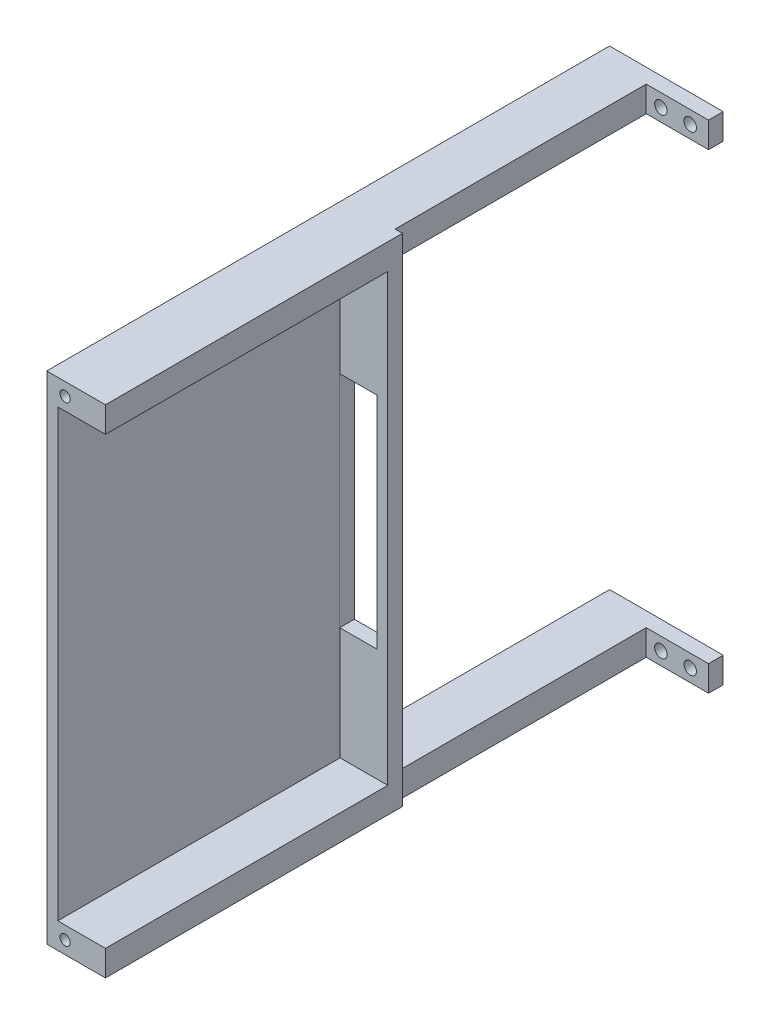
ISO-10303-21;
HEADER;
FILE_DESCRIPTION(('STEP AP214'),'2;1');
FILE_NAME('part.step','',(''),(''),'','','');
FILE_SCHEMA(('AUTOMOTIVE_DESIGN { 1 0 10303 214 1 1 1 1 }'));
ENDSEC;
DATA;
#1=APPLICATION_CONTEXT('core data for automotive mechanical design processes');
#2=APPLICATION_PROTOCOL_DEFINITION('international standard','automotive_design',2000,#1);
#3=PRODUCT_CONTEXT('',#1,'mechanical');
#4=PRODUCT('Part','Part','',(#3));
#5=PRODUCT_RELATED_PRODUCT_CATEGORY('part','',(#4));
#6=PRODUCT_DEFINITION_FORMATION('','',#4);
#7=PRODUCT_DEFINITION_CONTEXT('part definition',#1,'design');
#8=PRODUCT_DEFINITION('design','',#6,#7);
#9=PRODUCT_DEFINITION_SHAPE('','',#8);
#10=(LENGTH_UNIT() NAMED_UNIT(*) SI_UNIT(.MILLI.,.METRE.));
#11=(NAMED_UNIT(*) PLANE_ANGLE_UNIT() SI_UNIT($,.RADIAN.));
#12=(NAMED_UNIT(*) SI_UNIT($,.STERADIAN.) SOLID_ANGLE_UNIT());
#13=UNCERTAINTY_MEASURE_WITH_UNIT(LENGTH_MEASURE(1.E-05),#10,'distance_accuracy_value','');
#14=(GEOMETRIC_REPRESENTATION_CONTEXT(3) GLOBAL_UNCERTAINTY_ASSIGNED_CONTEXT((#13)) GLOBAL_UNIT_ASSIGNED_CONTEXT((#10,
#11,#12)) REPRESENTATION_CONTEXT('',''));
#15=CARTESIAN_POINT('',(0.,0.,0.));
#16=DIRECTION('',(0.,0.,1.));
#17=DIRECTION('',(1.,0.,0.));
#18=AXIS2_PLACEMENT_3D('',#15,#16,#17);
#19=CARTESIAN_POINT('',(-158.,64.2,390.9));
#20=DIRECTION('',(0.,0.,1.));
#21=DIRECTION('',(1.,0.,0.));
#22=AXIS2_PLACEMENT_3D('',#19,#20,#21);
#23=PLANE('',#22);
#24=CARTESIAN_POINT('',(-158.,64.2,390.9));
#25=DIRECTION('',(0.,0.,1.));
#26=DIRECTION('',(1.,0.,0.));
#27=AXIS2_PLACEMENT_3D('',#24,#25,#26);
#28=CIRCLE('',#27,1.4);
#29=CARTESIAN_POINT('',(-156.6,64.2,390.9));
#30=VERTEX_POINT('',#29);
#31=EDGE_CURVE('E512',#30,#30,#28,.T.);
#32=ORIENTED_EDGE('',*,*,#31,.T.);
#33=EDGE_LOOP('',(#32));
#34=FACE_BOUND('',#33,.T.);
#35=ADVANCED_FACE('F14',(#34),#23,.T.);
#36=CARTESIAN_POINT('',(-158.,-64.2,390.9));
#37=DIRECTION('',(0.,0.,1.));
#38=DIRECTION('',(1.,0.,0.));
#39=AXIS2_PLACEMENT_3D('',#36,#37,#38);
#40=PLANE('',#39);
#41=CARTESIAN_POINT('',(-158.,-64.2,390.9));
#42=DIRECTION('',(0.,0.,1.));
#43=DIRECTION('',(1.,0.,0.));
#44=AXIS2_PLACEMENT_3D('',#41,#42,#43);
#45=CIRCLE('',#44,1.4);
#46=CARTESIAN_POINT('',(-156.6,-64.2,390.9));
#47=VERTEX_POINT('',#46);
#48=EDGE_CURVE('E369',#47,#47,#45,.T.);
#49=ORIENTED_EDGE('',*,*,#48,.T.);
#50=EDGE_LOOP('',(#49));
#51=FACE_BOUND('',#50,.T.);
#52=ADVANCED_FACE('F653',(#51),#40,.T.);
#53=CARTESIAN_POINT('',(-160.1,-30.,322.1));
#54=DIRECTION('',(0.,0.,1.));
#55=DIRECTION('',(1.,0.,0.));
#56=AXIS2_PLACEMENT_3D('',#53,#54,#55);
#57=PLANE('',#56);
#58=DIRECTION('',(0.,-1.,0.));
#59=VECTOR('',#58,1.);
#60=CARTESIAN_POINT('',(-160.,-45.35,322.1));
#61=LINE('',#60,#59);
#62=CARTESIAN_POINT('',(-160.,30.,322.1));
#63=VERTEX_POINT('',#62);
#64=CARTESIAN_POINT('',(-160.,-30.,322.1));
#65=VERTEX_POINT('',#64);
#66=EDGE_CURVE('E356',#63,#65,#61,.T.);
#67=ORIENTED_EDGE('',*,*,#66,.T.);
#68=DIRECTION('',(1.,0.,0.));
#69=VECTOR('',#68,1.);
#70=CARTESIAN_POINT('',(-160.1,-30.,322.1));
#71=LINE('',#70,#69);
#72=CARTESIAN_POINT('',(-160.1,-30.,322.1));
#73=VERTEX_POINT('',#72);
#74=EDGE_CURVE('E473',#73,#65,#71,.T.);
#75=ORIENTED_EDGE('',*,*,#74,.F.);
#76=DIRECTION('',(0.,1.,0.));
#77=VECTOR('',#76,1.);
#78=CARTESIAN_POINT('',(-160.1,-30.,322.1));
#79=LINE('',#78,#77);
#80=CARTESIAN_POINT('',(-160.1,30.,322.1));
#81=VERTEX_POINT('',#80);
#82=EDGE_CURVE('E18',#73,#81,#79,.T.);
#83=ORIENTED_EDGE('',*,*,#82,.T.);
#84=DIRECTION('',(1.,0.,0.));
#85=VECTOR('',#84,1.);
#86=CARTESIAN_POINT('',(-160.1,30.,322.1));
#87=LINE('',#86,#85);
#88=EDGE_CURVE('E39',#81,#63,#87,.T.);
#89=ORIENTED_EDGE('',*,*,#88,.T.);
#90=EDGE_LOOP('',(#67,#75,#83,#89));
#91=FACE_BOUND('',#90,.T.);
#92=ADVANCED_FACE('F659',(#91),#57,.F.);
#93=CARTESIAN_POINT('',(-160.,-60.7,322.));
#94=DIRECTION('',(0.,0.,1.));
#95=DIRECTION('',(1.,0.,0.));
#96=AXIS2_PLACEMENT_3D('',#93,#94,#95);
#97=PLANE('',#96);
#98=DIRECTION('',(1.,0.,0.));
#99=VECTOR('',#98,1.);
#100=CARTESIAN_POINT('',(-160.,60.7,322.));
#101=LINE('',#100,#99);
#102=CARTESIAN_POINT('',(-160.,60.7,322.));
#103=VERTEX_POINT('',#102);
#104=CARTESIAN_POINT('',(-147.,60.7,322.));
#105=VERTEX_POINT('',#104);
#106=EDGE_CURVE('E490',#103,#105,#101,.T.);
#107=ORIENTED_EDGE('',*,*,#106,.F.);
#108=DIRECTION('',(0.,1.,0.));
#109=VECTOR('',#108,1.);
#110=CARTESIAN_POINT('',(-160.,-60.7,322.));
#111=LINE('',#110,#109);
#112=CARTESIAN_POINT('',(-160.,30.,322.));
#113=VERTEX_POINT('',#112);
#114=EDGE_CURVE('E378',#113,#103,#111,.T.);
#115=ORIENTED_EDGE('',*,*,#114,.F.);
#116=DIRECTION('',(-1.,0.,0.));
#117=VECTOR('',#116,1.);
#118=CARTESIAN_POINT('',(-160.05,30.,322.));
#119=LINE('',#118,#117);
#120=CARTESIAN_POINT('',(-150.,30.,322.));
#121=VERTEX_POINT('',#120);
#122=EDGE_CURVE('E506',#121,#113,#119,.T.);
#123=ORIENTED_EDGE('',*,*,#122,.F.);
#124=DIRECTION('',(0.,1.,0.));
#125=VECTOR('',#124,1.);
#126=CARTESIAN_POINT('',(-150.,-45.35,322.));
#127=LINE('',#126,#125);
#128=CARTESIAN_POINT('',(-150.,-30.,322.));
#129=VERTEX_POINT('',#128);
#130=EDGE_CURVE('E475',#129,#121,#127,.T.);
#131=ORIENTED_EDGE('',*,*,#130,.F.);
#132=DIRECTION('',(-1.,0.,0.));
#133=VECTOR('',#132,1.);
#134=CARTESIAN_POINT('',(-160.05,-30.,322.));
#135=LINE('',#134,#133);
#136=CARTESIAN_POINT('',(-160.,-30.,322.));
#137=VERTEX_POINT('',#136);
#138=EDGE_CURVE('E480',#129,#137,#135,.T.);
#139=ORIENTED_EDGE('',*,*,#138,.T.);
#140=DIRECTION('',(0.,1.,0.));
#141=VECTOR('',#140,1.);
#142=CARTESIAN_POINT('',(-160.,-60.7,322.));
#143=LINE('',#142,#141);
#144=CARTESIAN_POINT('',(-160.,-60.7,322.));
#145=VERTEX_POINT('',#144);
#146=EDGE_CURVE('E452',#145,#137,#143,.T.);
#147=ORIENTED_EDGE('',*,*,#146,.F.);
#148=DIRECTION('',(1.,0.,0.));
#149=VECTOR('',#148,1.);
#150=CARTESIAN_POINT('',(-160.,-60.7,322.));
#151=LINE('',#150,#149);
#152=CARTESIAN_POINT('',(-147.,-60.7,322.));
#153=VERTEX_POINT('',#152);
#154=EDGE_CURVE('E370',#145,#153,#151,.T.);
#155=ORIENTED_EDGE('',*,*,#154,.T.);
#156=DIRECTION('',(0.,-1.,0.));
#157=VECTOR('',#156,1.);
#158=CARTESIAN_POINT('',(-147.,-64.2,322.));
#159=LINE('',#158,#157);
#160=EDGE_CURVE('E327',#105,#153,#159,.T.);
#161=ORIENTED_EDGE('',*,*,#160,.F.);
#162=EDGE_LOOP('',(#107,#115,#123,#131,#139,#147,#155,#161));
#163=FACE_BOUND('',#162,.T.);
#164=ADVANCED_FACE('F691',(#163),#97,.T.);
#165=CARTESIAN_POINT('',(-137.,64.2,245.4));
#166=DIRECTION('',(0.,0.,1.));
#167=DIRECTION('',(1.,0.,0.));
#168=AXIS2_PLACEMENT_3D('',#165,#166,#167);
#169=CYLINDRICAL_SURFACE('',#168,1.7);
#170=DIRECTION('',(0.,0.,1.));
#171=VECTOR('',#170,1.);
#172=CARTESIAN_POINT('',(-135.3,64.2,245.4));
#173=LINE('',#172,#171);
#174=CARTESIAN_POINT('',(-135.3,64.2,245.5));
#175=VERTEX_POINT('',#174);
#176=CARTESIAN_POINT('',(-135.3,64.2,249.5));
#177=VERTEX_POINT('',#176);
#178=EDGE_CURVE('E9',#175,#177,#173,.T.);
#179=ORIENTED_EDGE('',*,*,#178,.F.);
#180=CARTESIAN_POINT('',(-137.,64.2,245.5));
#181=DIRECTION('',(0.,0.,1.));
#182=DIRECTION('',(1.,0.,0.));
#183=AXIS2_PLACEMENT_3D('',#180,#181,#182);
#184=CIRCLE('',#183,1.7);
#185=EDGE_CURVE('E332',#175,#175,#184,.T.);
#186=ORIENTED_EDGE('',*,*,#185,.F.);
#187=ORIENTED_EDGE('',*,*,#178,.T.);
#188=CARTESIAN_POINT('',(-137.,64.2,249.5));
#189=DIRECTION('',(0.,0.,1.));
#190=DIRECTION('',(1.,0.,0.));
#191=AXIS2_PLACEMENT_3D('',#188,#189,#190);
#192=CIRCLE('',#191,1.7);
#193=EDGE_CURVE('E328',#177,#177,#192,.T.);
#194=ORIENTED_EDGE('',*,*,#193,.T.);
#195=EDGE_LOOP('',(#179,#186,#187,#194));
#196=FACE_BOUND('',#195,.T.);
#197=ADVANCED_FACE('F693',(#196),#169,.F.);
#198=CARTESIAN_POINT('',(-145.,64.2,245.4));
#199=DIRECTION('',(0.,0.,1.));
#200=DIRECTION('',(1.,0.,0.));
#201=AXIS2_PLACEMENT_3D('',#198,#199,#200);
#202=CYLINDRICAL_SURFACE('',#201,1.7);
#203=DIRECTION('',(0.,0.,1.));
#204=VECTOR('',#203,1.);
#205=CARTESIAN_POINT('',(-143.3,64.2,245.4));
#206=LINE('',#205,#204);
#207=CARTESIAN_POINT('',(-143.3,64.2,245.5));
#208=VERTEX_POINT('',#207);
#209=CARTESIAN_POINT('',(-143.3,64.2,249.5));
#210=VERTEX_POINT('',#209);
#211=EDGE_CURVE('E25',#208,#210,#206,.T.);
#212=ORIENTED_EDGE('',*,*,#211,.F.);
#213=CARTESIAN_POINT('',(-145.,64.2,245.5));
#214=DIRECTION('',(0.,0.,1.));
#215=DIRECTION('',(1.,0.,0.));
#216=AXIS2_PLACEMENT_3D('',#213,#214,#215);
#217=CIRCLE('',#216,1.7);
#218=EDGE_CURVE('E281',#208,#208,#217,.T.);
#219=ORIENTED_EDGE('',*,*,#218,.F.);
#220=ORIENTED_EDGE('',*,*,#211,.T.);
#221=CARTESIAN_POINT('',(-145.,64.2,249.5));
#222=DIRECTION('',(0.,0.,1.));
#223=DIRECTION('',(1.,0.,0.));
#224=AXIS2_PLACEMENT_3D('',#221,#222,#223);
#225=CIRCLE('',#224,1.7);
#226=EDGE_CURVE('E371',#210,#210,#225,.T.);
#227=ORIENTED_EDGE('',*,*,#226,.T.);
#228=EDGE_LOOP('',(#212,#219,#220,#227));
#229=FACE_BOUND('',#228,.T.);
#230=ADVANCED_FACE('F709',(#229),#202,.F.);
#231=CARTESIAN_POINT('',(-160.1,30.,317.9));
#232=DIRECTION('',(0.,1.,0.));
#233=DIRECTION('',(1.,0.,0.));
#234=AXIS2_PLACEMENT_3D('',#231,#232,#233);
#235=PLANE('',#234);
#236=ORIENTED_EDGE('',*,*,#122,.T.);
#237=DIRECTION('',(0.,0.,1.));
#238=VECTOR('',#237,1.);
#239=CARTESIAN_POINT('',(-160.,30.,319.95));
#240=LINE('',#239,#238);
#241=EDGE_CURVE('E360',#113,#63,#240,.T.);
#242=ORIENTED_EDGE('',*,*,#241,.T.);
#243=ORIENTED_EDGE('',*,*,#88,.F.);
#244=DIRECTION('',(0.,0.,1.));
#245=VECTOR('',#244,1.);
#246=CARTESIAN_POINT('',(-160.1,30.,317.9));
#247=LINE('',#246,#245);
#248=CARTESIAN_POINT('',(-160.1,30.,318.));
#249=VERTEX_POINT('',#248);
#250=EDGE_CURVE('E437',#249,#81,#247,.T.);
#251=ORIENTED_EDGE('',*,*,#250,.F.);
#252=DIRECTION('',(-1.,0.,0.));
#253=VECTOR('',#252,1.);
#254=CARTESIAN_POINT('',(-161.55,30.,318.));
#255=LINE('',#254,#253);
#256=CARTESIAN_POINT('',(-150.,30.,318.));
#257=VERTEX_POINT('',#256);
#258=EDGE_CURVE('E377',#257,#249,#255,.T.);
#259=ORIENTED_EDGE('',*,*,#258,.F.);
#260=DIRECTION('',(0.,0.,1.));
#261=VECTOR('',#260,1.);
#262=CARTESIAN_POINT('',(-150.,30.,317.9));
#263=LINE('',#262,#261);
#264=EDGE_CURVE('E479',#257,#121,#263,.T.);
#265=ORIENTED_EDGE('',*,*,#264,.T.);
#266=EDGE_LOOP('',(#236,#242,#243,#251,#259,#265));
#267=FACE_BOUND('',#266,.T.);
#268=ADVANCED_FACE('F689',(#267),#235,.F.);
#269=CARTESIAN_POINT('',(-160.1,-30.,317.9));
#270=DIRECTION('',(1.,0.,0.));
#271=DIRECTION('',(0.,1.,0.));
#272=AXIS2_PLACEMENT_3D('',#269,#270,#271);
#273=PLANE('',#272);
#274=DIRECTION('',(0.,0.,1.));
#275=VECTOR('',#274,1.);
#276=CARTESIAN_POINT('',(-160.1,-30.,317.9));
#277=LINE('',#276,#275);
#278=CARTESIAN_POINT('',(-160.1,-30.,318.));
#279=VERTEX_POINT('',#278);
#280=EDGE_CURVE('E469',#279,#73,#277,.T.);
#281=ORIENTED_EDGE('',*,*,#280,.F.);
#282=DIRECTION('',(0.,1.,0.));
#283=VECTOR('',#282,1.);
#284=CARTESIAN_POINT('',(-160.1,-48.85,318.));
#285=LINE('',#284,#283);
#286=EDGE_CURVE('E306',#279,#249,#285,.T.);
#287=ORIENTED_EDGE('',*,*,#286,.T.);
#288=ORIENTED_EDGE('',*,*,#250,.T.);
#289=ORIENTED_EDGE('',*,*,#82,.F.);
#290=EDGE_LOOP('',(#281,#287,#288,#289));
#291=FACE_BOUND('',#290,.T.);
#292=ADVANCED_FACE('F686',(#291),#273,.T.);
#293=CARTESIAN_POINT('',(-150.,-30.,317.9));
#294=DIRECTION('',(1.,0.,0.));
#295=DIRECTION('',(0.,1.,0.));
#296=AXIS2_PLACEMENT_3D('',#293,#294,#295);
#297=PLANE('',#296);
#298=ORIENTED_EDGE('',*,*,#130,.T.);
#299=ORIENTED_EDGE('',*,*,#264,.F.);
#300=DIRECTION('',(0.,1.,0.));
#301=VECTOR('',#300,1.);
#302=CARTESIAN_POINT('',(-150.,-48.85,318.));
#303=LINE('',#302,#301);
#304=CARTESIAN_POINT('',(-150.,-30.,318.));
#305=VERTEX_POINT('',#304);
#306=EDGE_CURVE('E516',#305,#257,#303,.T.);
#307=ORIENTED_EDGE('',*,*,#306,.F.);
#308=DIRECTION('',(0.,0.,1.));
#309=VECTOR('',#308,1.);
#310=CARTESIAN_POINT('',(-150.,-30.,317.9));
#311=LINE('',#310,#309);
#312=EDGE_CURVE('E474',#305,#129,#311,.T.);
#313=ORIENTED_EDGE('',*,*,#312,.T.);
#314=EDGE_LOOP('',(#298,#299,#307,#313));
#315=FACE_BOUND('',#314,.T.);
#316=ADVANCED_FACE('F684',(#315),#297,.F.);
#317=CARTESIAN_POINT('',(-160.1,-30.,317.9));
#318=DIRECTION('',(0.,1.,0.));
#319=DIRECTION('',(1.,0.,0.));
#320=AXIS2_PLACEMENT_3D('',#317,#318,#319);
#321=PLANE('',#320);
#322=ORIENTED_EDGE('',*,*,#312,.F.);
#323=DIRECTION('',(-1.,0.,0.));
#324=VECTOR('',#323,1.);
#325=CARTESIAN_POINT('',(-161.55,-30.,318.));
#326=LINE('',#325,#324);
#327=EDGE_CURVE('E299',#305,#279,#326,.T.);
#328=ORIENTED_EDGE('',*,*,#327,.T.);
#329=ORIENTED_EDGE('',*,*,#280,.T.);
#330=ORIENTED_EDGE('',*,*,#74,.T.);
#331=DIRECTION('',(0.,0.,1.));
#332=VECTOR('',#331,1.);
#333=CARTESIAN_POINT('',(-160.,-30.,319.95));
#334=LINE('',#333,#332);
#335=EDGE_CURVE('E361',#137,#65,#334,.T.);
#336=ORIENTED_EDGE('',*,*,#335,.F.);
#337=ORIENTED_EDGE('',*,*,#138,.F.);
#338=EDGE_LOOP('',(#322,#328,#329,#330,#336,#337));
#339=FACE_BOUND('',#338,.T.);
#340=ADVANCED_FACE('F681',(#339),#321,.T.);
#341=CARTESIAN_POINT('',(-137.,-64.2,245.4));
#342=DIRECTION('',(0.,0.,1.));
#343=DIRECTION('',(1.,0.,0.));
#344=AXIS2_PLACEMENT_3D('',#341,#342,#343);
#345=CYLINDRICAL_SURFACE('',#344,1.7);
#346=DIRECTION('',(0.,0.,1.));
#347=VECTOR('',#346,1.);
#348=CARTESIAN_POINT('',(-135.3,-64.2,245.4));
#349=LINE('',#348,#347);
#350=CARTESIAN_POINT('',(-135.3,-64.2,245.5));
#351=VERTEX_POINT('',#350);
#352=CARTESIAN_POINT('',(-135.3,-64.2,249.5));
#353=VERTEX_POINT('',#352);
#354=EDGE_CURVE('E419',#351,#353,#349,.T.);
#355=ORIENTED_EDGE('',*,*,#354,.F.);
#356=CARTESIAN_POINT('',(-137.,-64.2,245.5));
#357=DIRECTION('',(0.,0.,1.));
#358=DIRECTION('',(1.,0.,0.));
#359=AXIS2_PLACEMENT_3D('',#356,#357,#358);
#360=CIRCLE('',#359,1.7);
#361=EDGE_CURVE('E386',#351,#351,#360,.T.);
#362=ORIENTED_EDGE('',*,*,#361,.F.);
#363=ORIENTED_EDGE('',*,*,#354,.T.);
#364=CARTESIAN_POINT('',(-137.,-64.2,249.5));
#365=DIRECTION('',(0.,0.,1.));
#366=DIRECTION('',(1.,0.,0.));
#367=AXIS2_PLACEMENT_3D('',#364,#365,#366);
#368=CIRCLE('',#367,1.7);
#369=EDGE_CURVE('E415',#353,#353,#368,.T.);
#370=ORIENTED_EDGE('',*,*,#369,.T.);
#371=EDGE_LOOP('',(#355,#362,#363,#370));
#372=FACE_BOUND('',#371,.T.);
#373=ADVANCED_FACE('F679',(#372),#345,.F.);
#374=CARTESIAN_POINT('',(-145.,-64.2,245.4));
#375=DIRECTION('',(0.,0.,1.));
#376=DIRECTION('',(1.,0.,0.));
#377=AXIS2_PLACEMENT_3D('',#374,#375,#376);
#378=CYLINDRICAL_SURFACE('',#377,1.7);
#379=DIRECTION('',(0.,0.,1.));
#380=VECTOR('',#379,1.);
#381=CARTESIAN_POINT('',(-143.3,-64.2,245.4));
#382=LINE('',#381,#380);
#383=CARTESIAN_POINT('',(-143.3,-64.2,245.5));
#384=VERTEX_POINT('',#383);
#385=CARTESIAN_POINT('',(-143.3,-64.2,249.5));
#386=VERTEX_POINT('',#385);
#387=EDGE_CURVE('E417',#384,#386,#382,.T.);
#388=ORIENTED_EDGE('',*,*,#387,.F.);
#389=CARTESIAN_POINT('',(-145.,-64.2,245.5));
#390=DIRECTION('',(0.,0.,1.));
#391=DIRECTION('',(1.,0.,0.));
#392=AXIS2_PLACEMENT_3D('',#389,#390,#391);
#393=CIRCLE('',#392,1.7);
#394=EDGE_CURVE('E397',#384,#384,#393,.T.);
#395=ORIENTED_EDGE('',*,*,#394,.F.);
#396=ORIENTED_EDGE('',*,*,#387,.T.);
#397=CARTESIAN_POINT('',(-145.,-64.2,249.5));
#398=DIRECTION('',(0.,0.,1.));
#399=DIRECTION('',(1.,0.,0.));
#400=AXIS2_PLACEMENT_3D('',#397,#398,#399);
#401=CIRCLE('',#400,1.7);
#402=EDGE_CURVE('E411',#386,#386,#401,.T.);
#403=ORIENTED_EDGE('',*,*,#402,.T.);
#404=EDGE_LOOP('',(#388,#395,#396,#403));
#405=FACE_BOUND('',#404,.T.);
#406=ADVANCED_FACE('F646',(#405),#378,.F.);
#407=CARTESIAN_POINT('',(-132.,-67.7,245.5));
#408=DIRECTION('',(1.,0.,0.));
#409=DIRECTION('',(0.,1.,0.));
#410=AXIS2_PLACEMENT_3D('',#407,#408,#409);
#411=PLANE('',#410);
#412=DIRECTION('',(0.,0.,1.));
#413=VECTOR('',#412,1.);
#414=CARTESIAN_POINT('',(-132.,-67.7,245.5));
#415=LINE('',#414,#413);
#416=CARTESIAN_POINT('',(-132.,-67.7,245.5));
#417=VERTEX_POINT('',#416);
#418=CARTESIAN_POINT('',(-132.,-67.7,249.5));
#419=VERTEX_POINT('',#418);
#420=EDGE_CURVE('E401',#417,#419,#415,.T.);
#421=ORIENTED_EDGE('',*,*,#420,.F.);
#422=DIRECTION('',(0.,1.,0.));
#423=VECTOR('',#422,1.);
#424=CARTESIAN_POINT('',(-132.,-67.7,245.5));
#425=LINE('',#424,#423);
#426=CARTESIAN_POINT('',(-132.,-60.7,245.5));
#427=VERTEX_POINT('',#426);
#428=EDGE_CURVE('E528',#417,#427,#425,.T.);
#429=ORIENTED_EDGE('',*,*,#428,.T.);
#430=DIRECTION('',(0.,0.,1.));
#431=VECTOR('',#430,1.);
#432=CARTESIAN_POINT('',(-132.,-60.7,245.5));
#433=LINE('',#432,#431);
#434=CARTESIAN_POINT('',(-132.,-60.7,249.5));
#435=VERTEX_POINT('',#434);
#436=EDGE_CURVE('E468',#427,#435,#433,.T.);
#437=ORIENTED_EDGE('',*,*,#436,.T.);
#438=DIRECTION('',(0.,1.,0.));
#439=VECTOR('',#438,1.);
#440=CARTESIAN_POINT('',(-132.,-67.7,249.5));
#441=LINE('',#440,#439);
#442=EDGE_CURVE('E416',#419,#435,#441,.T.);
#443=ORIENTED_EDGE('',*,*,#442,.F.);
#444=EDGE_LOOP('',(#421,#429,#437,#443));
#445=FACE_BOUND('',#444,.T.);
#446=ADVANCED_FACE('F633',(#445),#411,.T.);
#447=CARTESIAN_POINT('',(-163.,-67.7,249.5));
#448=DIRECTION('',(0.,0.,1.));
#449=DIRECTION('',(1.,0.,0.));
#450=AXIS2_PLACEMENT_3D('',#447,#448,#449);
#451=PLANE('',#450);
#452=ORIENTED_EDGE('',*,*,#369,.F.);
#453=EDGE_LOOP('',(#452));
#454=FACE_BOUND('',#453,.T.);
#455=ORIENTED_EDGE('',*,*,#402,.F.);
#456=EDGE_LOOP('',(#455));
#457=FACE_BOUND('',#456,.T.);
#458=DIRECTION('',(1.,0.,0.));
#459=VECTOR('',#458,1.);
#460=CARTESIAN_POINT('',(-163.,-60.7,249.5));
#461=LINE('',#460,#459);
#462=CARTESIAN_POINT('',(-149.,-60.7,249.5));
#463=VERTEX_POINT('',#462);
#464=EDGE_CURVE('E385',#463,#435,#461,.T.);
#465=ORIENTED_EDGE('',*,*,#464,.F.);
#466=DIRECTION('',(0.,-1.,0.));
#467=VECTOR('',#466,1.);
#468=CARTESIAN_POINT('',(-149.,-67.7,249.5));
#469=LINE('',#468,#467);
#470=CARTESIAN_POINT('',(-149.,-67.7,249.5));
#471=VERTEX_POINT('',#470);
#472=EDGE_CURVE('E515',#463,#471,#469,.T.);
#473=ORIENTED_EDGE('',*,*,#472,.T.);
#474=DIRECTION('',(1.,0.,0.));
#475=VECTOR('',#474,1.);
#476=CARTESIAN_POINT('',(-163.,-67.7,249.5));
#477=LINE('',#476,#475);
#478=EDGE_CURVE('E322',#471,#419,#477,.T.);
#479=ORIENTED_EDGE('',*,*,#478,.T.);
#480=ORIENTED_EDGE('',*,*,#442,.T.);
#481=EDGE_LOOP('',(#465,#473,#479,#480));
#482=FACE_BOUND('',#481,.T.);
#483=ADVANCED_FACE('F635',(#454,#457,#482),#451,.T.);
#484=CARTESIAN_POINT('',(-149.,-67.7,245.5));
#485=DIRECTION('',(1.,0.,0.));
#486=DIRECTION('',(0.,1.,0.));
#487=AXIS2_PLACEMENT_3D('',#484,#485,#486);
#488=PLANE('',#487);
#489=DIRECTION('',(0.,0.,1.));
#490=VECTOR('',#489,1.);
#491=CARTESIAN_POINT('',(-149.,-67.7,245.5));
#492=LINE('',#491,#490);
#493=CARTESIAN_POINT('',(-149.,-67.7,318.));
#494=VERTEX_POINT('',#493);
#495=EDGE_CURVE('E317',#471,#494,#492,.T.);
#496=ORIENTED_EDGE('',*,*,#495,.F.);
#497=ORIENTED_EDGE('',*,*,#472,.F.);
#498=DIRECTION('',(0.,0.,1.));
#499=VECTOR('',#498,1.);
#500=CARTESIAN_POINT('',(-149.,-60.7,245.5));
#501=LINE('',#500,#499);
#502=CARTESIAN_POINT('',(-149.,-60.7,318.));
#503=VERTEX_POINT('',#502);
#504=EDGE_CURVE('E381',#463,#503,#501,.T.);
#505=ORIENTED_EDGE('',*,*,#504,.T.);
#506=DIRECTION('',(0.,1.,0.));
#507=VECTOR('',#506,1.);
#508=CARTESIAN_POINT('',(-149.,-67.7,318.));
#509=LINE('',#508,#507);
#510=EDGE_CURVE('E520',#494,#503,#509,.T.);
#511=ORIENTED_EDGE('',*,*,#510,.F.);
#512=EDGE_LOOP('',(#496,#497,#505,#511));
#513=FACE_BOUND('',#512,.T.);
#514=ADVANCED_FACE('F620',(#513),#488,.T.);
#515=CARTESIAN_POINT('',(-158.,64.2,390.9));
#516=DIRECTION('',(0.,0.,1.));
#517=DIRECTION('',(1.,0.,0.));
#518=AXIS2_PLACEMENT_3D('',#515,#516,#517);
#519=CYLINDRICAL_SURFACE('',#518,1.4);
#520=DIRECTION('',(0.,0.,1.));
#521=VECTOR('',#520,1.);
#522=CARTESIAN_POINT('',(-156.6,64.2,390.9));
#523=LINE('',#522,#521);
#524=CARTESIAN_POINT('',(-156.6,64.2,399.));
#525=VERTEX_POINT('',#524);
#526=EDGE_CURVE('E500',#30,#525,#523,.T.);
#527=ORIENTED_EDGE('',*,*,#526,.F.);
#528=ORIENTED_EDGE('',*,*,#31,.F.);
#529=ORIENTED_EDGE('',*,*,#526,.T.);
#530=CARTESIAN_POINT('',(-158.,64.2,399.));
#531=DIRECTION('',(0.,0.,1.));
#532=DIRECTION('',(1.,0.,0.));
#533=AXIS2_PLACEMENT_3D('',#530,#531,#532);
#534=CIRCLE('',#533,1.4);
#535=EDGE_CURVE('E312',#525,#525,#534,.T.);
#536=ORIENTED_EDGE('',*,*,#535,.T.);
#537=EDGE_LOOP('',(#527,#528,#529,#536));
#538=FACE_BOUND('',#537,.T.);
#539=ADVANCED_FACE('F644',(#538),#519,.F.);
#540=CARTESIAN_POINT('',(-158.,-64.2,390.9));
#541=DIRECTION('',(0.,0.,1.));
#542=DIRECTION('',(1.,0.,0.));
#543=AXIS2_PLACEMENT_3D('',#540,#541,#542);
#544=CYLINDRICAL_SURFACE('',#543,1.4);
#545=DIRECTION('',(0.,0.,1.));
#546=VECTOR('',#545,1.);
#547=CARTESIAN_POINT('',(-156.6,-64.2,390.9));
#548=LINE('',#547,#546);
#549=CARTESIAN_POINT('',(-156.6,-64.2,399.));
#550=VERTEX_POINT('',#549);
#551=EDGE_CURVE('E366',#47,#550,#548,.T.);
#552=ORIENTED_EDGE('',*,*,#551,.F.);
#553=ORIENTED_EDGE('',*,*,#48,.F.);
#554=ORIENTED_EDGE('',*,*,#551,.T.);
#555=CARTESIAN_POINT('',(-158.,-64.2,399.));
#556=DIRECTION('',(0.,0.,1.));
#557=DIRECTION('',(1.,0.,0.));
#558=AXIS2_PLACEMENT_3D('',#555,#556,#557);
#559=CIRCLE('',#558,1.4);
#560=EDGE_CURVE('E316',#550,#550,#559,.T.);
#561=ORIENTED_EDGE('',*,*,#560,.T.);
#562=EDGE_LOOP('',(#552,#553,#554,#561));
#563=FACE_BOUND('',#562,.T.);
#564=ADVANCED_FACE('F675',(#563),#544,.F.);
#565=CARTESIAN_POINT('',(-160.,-60.7,322.));
#566=DIRECTION('',(0.,1.,0.));
#567=DIRECTION('',(1.,0.,0.));
#568=AXIS2_PLACEMENT_3D('',#565,#566,#567);
#569=PLANE('',#568);
#570=ORIENTED_EDGE('',*,*,#154,.F.);
#571=DIRECTION('',(0.,0.,1.));
#572=VECTOR('',#571,1.);
#573=CARTESIAN_POINT('',(-160.,-60.7,322.));
#574=LINE('',#573,#572);
#575=CARTESIAN_POINT('',(-160.,-60.7,399.));
#576=VERTEX_POINT('',#575);
#577=EDGE_CURVE('E543',#145,#576,#574,.T.);
#578=ORIENTED_EDGE('',*,*,#577,.T.);
#579=DIRECTION('',(-1.,0.,0.));
#580=VECTOR('',#579,1.);
#581=CARTESIAN_POINT('',(-161.5,-60.7,399.));
#582=LINE('',#581,#580);
#583=CARTESIAN_POINT('',(-147.,-60.7,399.));
#584=VERTEX_POINT('',#583);
#585=EDGE_CURVE('E453',#584,#576,#582,.T.);
#586=ORIENTED_EDGE('',*,*,#585,.F.);
#587=DIRECTION('',(0.,0.,1.));
#588=VECTOR('',#587,1.);
#589=CARTESIAN_POINT('',(-147.,-60.7,320.));
#590=LINE('',#589,#588);
#591=EDGE_CURVE('E355',#153,#584,#590,.T.);
#592=ORIENTED_EDGE('',*,*,#591,.F.);
#593=EDGE_LOOP('',(#570,#578,#586,#592));
#594=FACE_BOUND('',#593,.T.);
#595=ADVANCED_FACE('F16',(#594),#569,.T.);
#596=CARTESIAN_POINT('',(-160.,-60.7,322.));
#597=DIRECTION('',(1.,0.,0.));
#598=DIRECTION('',(0.,1.,0.));
#599=AXIS2_PLACEMENT_3D('',#596,#597,#598);
#600=PLANE('',#599);
#601=ORIENTED_EDGE('',*,*,#577,.F.);
#602=ORIENTED_EDGE('',*,*,#146,.T.);
#603=ORIENTED_EDGE('',*,*,#335,.T.);
#604=ORIENTED_EDGE('',*,*,#66,.F.);
#605=ORIENTED_EDGE('',*,*,#241,.F.);
#606=ORIENTED_EDGE('',*,*,#114,.T.);
#607=DIRECTION('',(0.,0.,1.));
#608=VECTOR('',#607,1.);
#609=CARTESIAN_POINT('',(-160.,60.7,322.));
#610=LINE('',#609,#608);
#611=CARTESIAN_POINT('',(-160.,60.7,399.));
#612=VERTEX_POINT('',#611);
#613=EDGE_CURVE('E486',#103,#612,#610,.T.);
#614=ORIENTED_EDGE('',*,*,#613,.T.);
#615=DIRECTION('',(0.,1.,0.));
#616=VECTOR('',#615,1.);
#617=CARTESIAN_POINT('',(-160.,-64.2,399.));
#618=LINE('',#617,#616);
#619=EDGE_CURVE('E457',#576,#612,#618,.T.);
#620=ORIENTED_EDGE('',*,*,#619,.F.);
#621=EDGE_LOOP('',(#601,#602,#603,#604,#605,#606,#614,#620));
#622=FACE_BOUND('',#621,.T.);
#623=ADVANCED_FACE('F663',(#622),#600,.T.);
#624=CARTESIAN_POINT('',(-160.,60.7,322.));
#625=DIRECTION('',(0.,1.,0.));
#626=DIRECTION('',(1.,0.,0.));
#627=AXIS2_PLACEMENT_3D('',#624,#625,#626);
#628=PLANE('',#627);
#629=DIRECTION('',(0.,0.,1.));
#630=VECTOR('',#629,1.);
#631=CARTESIAN_POINT('',(-147.,60.7,320.));
#632=LINE('',#631,#630);
#633=CARTESIAN_POINT('',(-147.,60.7,399.));
#634=VERTEX_POINT('',#633);
#635=EDGE_CURVE('E323',#105,#634,#632,.T.);
#636=ORIENTED_EDGE('',*,*,#635,.T.);
#637=DIRECTION('',(-1.,0.,0.));
#638=VECTOR('',#637,1.);
#639=CARTESIAN_POINT('',(-161.5,60.7,399.));
#640=LINE('',#639,#638);
#641=EDGE_CURVE('E310',#634,#612,#640,.T.);
#642=ORIENTED_EDGE('',*,*,#641,.T.);
#643=ORIENTED_EDGE('',*,*,#613,.F.);
#644=ORIENTED_EDGE('',*,*,#106,.T.);
#645=EDGE_LOOP('',(#636,#642,#643,#644));
#646=FACE_BOUND('',#645,.T.);
#647=ADVANCED_FACE('F791',(#646),#628,.F.);
#648=CARTESIAN_POINT('',(-147.,-67.7,318.));
#649=DIRECTION('',(1.,0.,0.));
#650=DIRECTION('',(0.,1.,0.));
#651=AXIS2_PLACEMENT_3D('',#648,#649,#650);
#652=PLANE('',#651);
#653=DIRECTION('',(0.,1.,0.));
#654=VECTOR('',#653,1.);
#655=CARTESIAN_POINT('',(-147.,-67.7,399.));
#656=LINE('',#655,#654);
#657=CARTESIAN_POINT('',(-147.,-67.7,399.));
#658=VERTEX_POINT('',#657);
#659=EDGE_CURVE('E458',#658,#584,#656,.T.);
#660=ORIENTED_EDGE('',*,*,#659,.F.);
#661=DIRECTION('',(0.,0.,1.));
#662=VECTOR('',#661,1.);
#663=CARTESIAN_POINT('',(-147.,-67.7,318.));
#664=LINE('',#663,#662);
#665=CARTESIAN_POINT('',(-147.,-67.7,318.));
#666=VERTEX_POINT('',#665);
#667=EDGE_CURVE('E315',#666,#658,#664,.T.);
#668=ORIENTED_EDGE('',*,*,#667,.F.);
#669=DIRECTION('',(0.,1.,0.));
#670=VECTOR('',#669,1.);
#671=CARTESIAN_POINT('',(-147.,-67.7,318.));
#672=LINE('',#671,#670);
#673=CARTESIAN_POINT('',(-147.,67.7,318.));
#674=VERTEX_POINT('',#673);
#675=EDGE_CURVE('E531',#666,#674,#672,.T.);
#676=ORIENTED_EDGE('',*,*,#675,.T.);
#677=DIRECTION('',(0.,0.,1.));
#678=VECTOR('',#677,1.);
#679=CARTESIAN_POINT('',(-147.,67.7,318.));
#680=LINE('',#679,#678);
#681=CARTESIAN_POINT('',(-147.,67.7,399.));
#682=VERTEX_POINT('',#681);
#683=EDGE_CURVE('E342',#674,#682,#680,.T.);
#684=ORIENTED_EDGE('',*,*,#683,.T.);
#685=DIRECTION('',(0.,1.,0.));
#686=VECTOR('',#685,1.);
#687=CARTESIAN_POINT('',(-147.,-67.7,399.));
#688=LINE('',#687,#686);
#689=EDGE_CURVE('E351',#634,#682,#688,.T.);
#690=ORIENTED_EDGE('',*,*,#689,.F.);
#691=ORIENTED_EDGE('',*,*,#635,.F.);
#692=ORIENTED_EDGE('',*,*,#160,.T.);
#693=ORIENTED_EDGE('',*,*,#591,.T.);
#694=EDGE_LOOP('',(#660,#668,#676,#684,#690,#691,#692,#693));
#695=FACE_BOUND('',#694,.T.);
#696=ADVANCED_FACE('F614',(#695),#652,.T.);
#697=CARTESIAN_POINT('',(-132.,60.7,245.5));
#698=DIRECTION('',(1.,0.,0.));
#699=DIRECTION('',(0.,1.,0.));
#700=AXIS2_PLACEMENT_3D('',#697,#698,#699);
#701=PLANE('',#700);
#702=DIRECTION('',(0.,0.,1.));
#703=VECTOR('',#702,1.);
#704=CARTESIAN_POINT('',(-132.,60.7,245.5));
#705=LINE('',#704,#703);
#706=CARTESIAN_POINT('',(-132.,60.7,245.5));
#707=VERTEX_POINT('',#706);
#708=CARTESIAN_POINT('',(-132.,60.7,249.5));
#709=VERTEX_POINT('',#708);
#710=EDGE_CURVE('E285',#707,#709,#705,.T.);
#711=ORIENTED_EDGE('',*,*,#710,.F.);
#712=DIRECTION('',(0.,1.,0.));
#713=VECTOR('',#712,1.);
#714=CARTESIAN_POINT('',(-132.,60.7,245.5));
#715=LINE('',#714,#713);
#716=CARTESIAN_POINT('',(-132.,67.7,245.5));
#717=VERTEX_POINT('',#716);
#718=EDGE_CURVE('E269',#707,#717,#715,.T.);
#719=ORIENTED_EDGE('',*,*,#718,.T.);
#720=DIRECTION('',(0.,0.,1.));
#721=VECTOR('',#720,1.);
#722=CARTESIAN_POINT('',(-132.,67.7,245.5));
#723=LINE('',#722,#721);
#724=CARTESIAN_POINT('',(-132.,67.7,249.5));
#725=VERTEX_POINT('',#724);
#726=EDGE_CURVE('E509',#717,#725,#723,.T.);
#727=ORIENTED_EDGE('',*,*,#726,.T.);
#728=DIRECTION('',(0.,1.,0.));
#729=VECTOR('',#728,1.);
#730=CARTESIAN_POINT('',(-132.,60.7,249.5));
#731=LINE('',#730,#729);
#732=EDGE_CURVE('E287',#709,#725,#731,.T.);
#733=ORIENTED_EDGE('',*,*,#732,.F.);
#734=EDGE_LOOP('',(#711,#719,#727,#733));
#735=FACE_BOUND('',#734,.T.);
#736=ADVANCED_FACE('F286',(#735),#701,.T.);
#737=CARTESIAN_POINT('',(-163.,60.7,249.5));
#738=DIRECTION('',(0.,0.,1.));
#739=DIRECTION('',(1.,0.,0.));
#740=AXIS2_PLACEMENT_3D('',#737,#738,#739);
#741=PLANE('',#740);
#742=ORIENTED_EDGE('',*,*,#193,.F.);
#743=EDGE_LOOP('',(#742));
#744=FACE_BOUND('',#743,.T.);
#745=ORIENTED_EDGE('',*,*,#226,.F.);
#746=EDGE_LOOP('',(#745));
#747=FACE_BOUND('',#746,.T.);
#748=DIRECTION('',(1.,0.,0.));
#749=VECTOR('',#748,1.);
#750=CARTESIAN_POINT('',(-163.,67.7,249.5));
#751=LINE('',#750,#749);
#752=CARTESIAN_POINT('',(-149.,67.7,249.5));
#753=VERTEX_POINT('',#752);
#754=EDGE_CURVE('E407',#753,#725,#751,.T.);
#755=ORIENTED_EDGE('',*,*,#754,.F.);
#756=DIRECTION('',(0.,-1.,0.));
#757=VECTOR('',#756,1.);
#758=CARTESIAN_POINT('',(-149.,60.7,249.5));
#759=LINE('',#758,#757);
#760=CARTESIAN_POINT('',(-149.,60.7,249.5));
#761=VERTEX_POINT('',#760);
#762=EDGE_CURVE('E421',#753,#761,#759,.T.);
#763=ORIENTED_EDGE('',*,*,#762,.T.);
#764=DIRECTION('',(1.,0.,0.));
#765=VECTOR('',#764,1.);
#766=CARTESIAN_POINT('',(-163.,60.7,249.5));
#767=LINE('',#766,#765);
#768=EDGE_CURVE('E292',#761,#709,#767,.T.);
#769=ORIENTED_EDGE('',*,*,#768,.T.);
#770=ORIENTED_EDGE('',*,*,#732,.T.);
#771=EDGE_LOOP('',(#755,#763,#769,#770));
#772=FACE_BOUND('',#771,.T.);
#773=ADVANCED_FACE('F667',(#744,#747,#772),#741,.T.);
#774=CARTESIAN_POINT('',(-149.,60.7,245.5));
#775=DIRECTION('',(1.,0.,0.));
#776=DIRECTION('',(0.,1.,0.));
#777=AXIS2_PLACEMENT_3D('',#774,#775,#776);
#778=PLANE('',#777);
#779=DIRECTION('',(0.,0.,1.));
#780=VECTOR('',#779,1.);
#781=CARTESIAN_POINT('',(-149.,60.7,245.5));
#782=LINE('',#781,#780);
#783=CARTESIAN_POINT('',(-149.,60.7,318.));
#784=VERTEX_POINT('',#783);
#785=EDGE_CURVE('E282',#761,#784,#782,.T.);
#786=ORIENTED_EDGE('',*,*,#785,.F.);
#787=ORIENTED_EDGE('',*,*,#762,.F.);
#788=DIRECTION('',(0.,0.,1.));
#789=VECTOR('',#788,1.);
#790=CARTESIAN_POINT('',(-149.,67.7,245.5));
#791=LINE('',#790,#789);
#792=CARTESIAN_POINT('',(-149.,67.7,318.));
#793=VERTEX_POINT('',#792);
#794=EDGE_CURVE('E391',#753,#793,#791,.T.);
#795=ORIENTED_EDGE('',*,*,#794,.T.);
#796=DIRECTION('',(0.,1.,0.));
#797=VECTOR('',#796,1.);
#798=CARTESIAN_POINT('',(-149.,60.7,318.));
#799=LINE('',#798,#797);
#800=EDGE_CURVE('E442',#784,#793,#799,.T.);
#801=ORIENTED_EDGE('',*,*,#800,.F.);
#802=EDGE_LOOP('',(#786,#787,#795,#801));
#803=FACE_BOUND('',#802,.T.);
#804=ADVANCED_FACE('F611',(#803),#778,.T.);
#805=CARTESIAN_POINT('',(-163.,60.7,245.5));
#806=DIRECTION('',(0.,0.,1.));
#807=DIRECTION('',(1.,0.,0.));
#808=AXIS2_PLACEMENT_3D('',#805,#806,#807);
#809=PLANE('',#808);
#810=ORIENTED_EDGE('',*,*,#185,.T.);
#811=EDGE_LOOP('',(#810));
#812=FACE_BOUND('',#811,.T.);
#813=ORIENTED_EDGE('',*,*,#218,.T.);
#814=EDGE_LOOP('',(#813));
#815=FACE_BOUND('',#814,.T.);
#816=DIRECTION('',(-1.,0.,0.));
#817=VECTOR('',#816,1.);
#818=CARTESIAN_POINT('',(-132.,67.7,245.5));
#819=LINE('',#818,#817);
#820=CARTESIAN_POINT('',(-163.,67.7,245.5));
#821=VERTEX_POINT('',#820);
#822=EDGE_CURVE('E276',#717,#821,#819,.T.);
#823=ORIENTED_EDGE('',*,*,#822,.F.);
#824=ORIENTED_EDGE('',*,*,#718,.F.);
#825=DIRECTION('',(1.,0.,0.));
#826=VECTOR('',#825,1.);
#827=CARTESIAN_POINT('',(-163.,60.7,245.5));
#828=LINE('',#827,#826);
#829=CARTESIAN_POINT('',(-163.,60.7,245.5));
#830=VERTEX_POINT('',#829);
#831=EDGE_CURVE('E274',#830,#707,#828,.T.);
#832=ORIENTED_EDGE('',*,*,#831,.F.);
#833=DIRECTION('',(0.,1.,0.));
#834=VECTOR('',#833,1.);
#835=CARTESIAN_POINT('',(-163.,60.7,245.5));
#836=LINE('',#835,#834);
#837=EDGE_CURVE('E333',#830,#821,#836,.T.);
#838=ORIENTED_EDGE('',*,*,#837,.T.);
#839=EDGE_LOOP('',(#823,#824,#832,#838));
#840=FACE_BOUND('',#839,.T.);
#841=ADVANCED_FACE('F271',(#812,#815,#840),#809,.F.);
#842=CARTESIAN_POINT('',(-163.,60.7,245.5));
#843=DIRECTION('',(0.,1.,0.));
#844=DIRECTION('',(1.,0.,0.));
#845=AXIS2_PLACEMENT_3D('',#842,#843,#844);
#846=PLANE('',#845);
#847=DIRECTION('',(1.,0.,0.));
#848=VECTOR('',#847,1.);
#849=CARTESIAN_POINT('',(-163.,60.7,318.));
#850=LINE('',#849,#848);
#851=CARTESIAN_POINT('',(-163.,60.7,318.));
#852=VERTEX_POINT('',#851);
#853=EDGE_CURVE('E439',#852,#784,#850,.T.);
#854=ORIENTED_EDGE('',*,*,#853,.F.);
#855=DIRECTION('',(0.,0.,1.));
#856=VECTOR('',#855,1.);
#857=CARTESIAN_POINT('',(-163.,60.7,245.5));
#858=LINE('',#857,#856);
#859=EDGE_CURVE('E296',#830,#852,#858,.T.);
#860=ORIENTED_EDGE('',*,*,#859,.F.);
#861=ORIENTED_EDGE('',*,*,#831,.T.);
#862=ORIENTED_EDGE('',*,*,#710,.T.);
#863=ORIENTED_EDGE('',*,*,#768,.F.);
#864=ORIENTED_EDGE('',*,*,#785,.T.);
#865=EDGE_LOOP('',(#854,#860,#861,#862,#863,#864));
#866=FACE_BOUND('',#865,.T.);
#867=ADVANCED_FACE('F294',(#866),#846,.F.);
#868=CARTESIAN_POINT('',(-163.,-67.7,318.));
#869=DIRECTION('',(0.,0.,1.));
#870=DIRECTION('',(1.,0.,0.));
#871=AXIS2_PLACEMENT_3D('',#868,#869,#870);
#872=PLANE('',#871);
#873=ORIENTED_EDGE('',*,*,#306,.T.);
#874=ORIENTED_EDGE('',*,*,#258,.T.);
#875=ORIENTED_EDGE('',*,*,#286,.F.);
#876=ORIENTED_EDGE('',*,*,#327,.F.);
#877=EDGE_LOOP('',(#873,#874,#875,#876));
#878=FACE_BOUND('',#877,.T.);
#879=ORIENTED_EDGE('',*,*,#853,.T.);
#880=ORIENTED_EDGE('',*,*,#800,.T.);
#881=DIRECTION('',(1.,0.,0.));
#882=VECTOR('',#881,1.);
#883=CARTESIAN_POINT('',(-163.,67.7,318.));
#884=LINE('',#883,#882);
#885=EDGE_CURVE('E387',#793,#674,#884,.T.);
#886=ORIENTED_EDGE('',*,*,#885,.T.);
#887=ORIENTED_EDGE('',*,*,#675,.F.);
#888=DIRECTION('',(1.,0.,0.));
#889=VECTOR('',#888,1.);
#890=CARTESIAN_POINT('',(-163.,-67.7,318.));
#891=LINE('',#890,#889);
#892=EDGE_CURVE('E321',#494,#666,#891,.T.);
#893=ORIENTED_EDGE('',*,*,#892,.F.);
#894=ORIENTED_EDGE('',*,*,#510,.T.);
#895=DIRECTION('',(1.,0.,0.));
#896=VECTOR('',#895,1.);
#897=CARTESIAN_POINT('',(-163.,-60.7,318.));
#898=LINE('',#897,#896);
#899=CARTESIAN_POINT('',(-163.,-60.7,318.));
#900=VERTEX_POINT('',#899);
#901=EDGE_CURVE('E443',#900,#503,#898,.T.);
#902=ORIENTED_EDGE('',*,*,#901,.F.);
#903=DIRECTION('',(0.,1.,0.));
#904=VECTOR('',#903,1.);
#905=CARTESIAN_POINT('',(-163.,-67.7,318.));
#906=LINE('',#905,#904);
#907=EDGE_CURVE('E495',#900,#852,#906,.T.);
#908=ORIENTED_EDGE('',*,*,#907,.T.);
#909=EDGE_LOOP('',(#879,#880,#886,#887,#893,#894,#902,#908));
#910=FACE_BOUND('',#909,.T.);
#911=ADVANCED_FACE('F608',(#878,#910),#872,.F.);
#912=CARTESIAN_POINT('',(-163.,-60.7,245.5));
#913=DIRECTION('',(0.,1.,0.));
#914=DIRECTION('',(1.,0.,0.));
#915=AXIS2_PLACEMENT_3D('',#912,#913,#914);
#916=PLANE('',#915);
#917=ORIENTED_EDGE('',*,*,#504,.F.);
#918=ORIENTED_EDGE('',*,*,#464,.T.);
#919=ORIENTED_EDGE('',*,*,#436,.F.);
#920=DIRECTION('',(-1.,0.,0.));
#921=VECTOR('',#920,1.);
#922=CARTESIAN_POINT('',(-132.,-60.7,245.5));
#923=LINE('',#922,#921);
#924=CARTESIAN_POINT('',(-163.,-60.7,245.5));
#925=VERTEX_POINT('',#924);
#926=EDGE_CURVE('E365',#427,#925,#923,.T.);
#927=ORIENTED_EDGE('',*,*,#926,.T.);
#928=DIRECTION('',(0.,0.,-1.));
#929=VECTOR('',#928,1.);
#930=CARTESIAN_POINT('',(-163.,-60.7,318.));
#931=LINE('',#930,#929);
#932=EDGE_CURVE('E491',#900,#925,#931,.T.);
#933=ORIENTED_EDGE('',*,*,#932,.F.);
#934=ORIENTED_EDGE('',*,*,#901,.T.);
#935=EDGE_LOOP('',(#917,#918,#919,#927,#933,#934));
#936=FACE_BOUND('',#935,.T.);
#937=ADVANCED_FACE('F624',(#936),#916,.T.);
#938=CARTESIAN_POINT('',(-163.,-67.7,245.5));
#939=DIRECTION('',(0.,0.,1.));
#940=DIRECTION('',(1.,0.,0.));
#941=AXIS2_PLACEMENT_3D('',#938,#939,#940);
#942=PLANE('',#941);
#943=ORIENTED_EDGE('',*,*,#361,.T.);
#944=EDGE_LOOP('',(#943));
#945=FACE_BOUND('',#944,.T.);
#946=ORIENTED_EDGE('',*,*,#394,.T.);
#947=EDGE_LOOP('',(#946));
#948=FACE_BOUND('',#947,.T.);
#949=ORIENTED_EDGE('',*,*,#926,.F.);
#950=ORIENTED_EDGE('',*,*,#428,.F.);
#951=DIRECTION('',(1.,0.,0.));
#952=VECTOR('',#951,1.);
#953=CARTESIAN_POINT('',(-163.,-67.7,245.5));
#954=LINE('',#953,#952);
#955=CARTESIAN_POINT('',(-163.,-67.7,245.5));
#956=VERTEX_POINT('',#955);
#957=EDGE_CURVE('E503',#956,#417,#954,.T.);
#958=ORIENTED_EDGE('',*,*,#957,.F.);
#959=DIRECTION('',(0.,1.,0.));
#960=VECTOR('',#959,1.);
#961=CARTESIAN_POINT('',(-163.,-67.7,245.5));
#962=LINE('',#961,#960);
#963=EDGE_CURVE('E494',#956,#925,#962,.T.);
#964=ORIENTED_EDGE('',*,*,#963,.T.);
#965=EDGE_LOOP('',(#949,#950,#958,#964));
#966=FACE_BOUND('',#965,.T.);
#967=ADVANCED_FACE('F628',(#945,#948,#966),#942,.F.);
#968=CARTESIAN_POINT('',(-163.,-67.7,318.));
#969=DIRECTION('',(0.,1.,0.));
#970=DIRECTION('',(1.,0.,0.));
#971=AXIS2_PLACEMENT_3D('',#968,#969,#970);
#972=PLANE('',#971);
#973=ORIENTED_EDGE('',*,*,#667,.T.);
#974=DIRECTION('',(1.,0.,0.));
#975=VECTOR('',#974,1.);
#976=CARTESIAN_POINT('',(-163.,-67.7,399.));
#977=LINE('',#976,#975);
#978=CARTESIAN_POINT('',(-163.,-67.7,399.));
#979=VERTEX_POINT('',#978);
#980=EDGE_CURVE('E346',#979,#658,#977,.T.);
#981=ORIENTED_EDGE('',*,*,#980,.F.);
#982=DIRECTION('',(0.,0.,1.));
#983=VECTOR('',#982,1.);
#984=CARTESIAN_POINT('',(-163.,-67.7,245.5));
#985=LINE('',#984,#983);
#986=EDGE_CURVE('E341',#956,#979,#985,.T.);
#987=ORIENTED_EDGE('',*,*,#986,.F.);
#988=ORIENTED_EDGE('',*,*,#957,.T.);
#989=ORIENTED_EDGE('',*,*,#420,.T.);
#990=ORIENTED_EDGE('',*,*,#478,.F.);
#991=ORIENTED_EDGE('',*,*,#495,.T.);
#992=ORIENTED_EDGE('',*,*,#892,.T.);
#993=EDGE_LOOP('',(#973,#981,#987,#988,#989,#990,#991,#992));
#994=FACE_BOUND('',#993,.T.);
#995=ADVANCED_FACE('F578',(#994),#972,.F.);
#996=CARTESIAN_POINT('',(-163.,-67.7,399.));
#997=DIRECTION('',(0.,0.,1.));
#998=DIRECTION('',(1.,0.,0.));
#999=AXIS2_PLACEMENT_3D('',#996,#997,#998);
#1000=PLANE('',#999);
#1001=ORIENTED_EDGE('',*,*,#535,.F.);
#1002=EDGE_LOOP('',(#1001));
#1003=FACE_BOUND('',#1002,.T.);
#1004=ORIENTED_EDGE('',*,*,#560,.F.);
#1005=EDGE_LOOP('',(#1004));
#1006=FACE_BOUND('',#1005,.T.);
#1007=DIRECTION('',(1.,0.,0.));
#1008=VECTOR('',#1007,1.);
#1009=CARTESIAN_POINT('',(-163.,67.7,399.));
#1010=LINE('',#1009,#1008);
#1011=CARTESIAN_POINT('',(-163.,67.7,399.));
#1012=VERTEX_POINT('',#1011);
#1013=EDGE_CURVE('E347',#1012,#682,#1010,.T.);
#1014=ORIENTED_EDGE('',*,*,#1013,.F.);
#1015=DIRECTION('',(0.,1.,0.));
#1016=VECTOR('',#1015,1.);
#1017=CARTESIAN_POINT('',(-163.,-67.7,399.));
#1018=LINE('',#1017,#1016);
#1019=EDGE_CURVE('E336',#979,#1012,#1018,.T.);
#1020=ORIENTED_EDGE('',*,*,#1019,.F.);
#1021=ORIENTED_EDGE('',*,*,#980,.T.);
#1022=ORIENTED_EDGE('',*,*,#659,.T.);
#1023=ORIENTED_EDGE('',*,*,#585,.T.);
#1024=ORIENTED_EDGE('',*,*,#619,.T.);
#1025=ORIENTED_EDGE('',*,*,#641,.F.);
#1026=ORIENTED_EDGE('',*,*,#689,.T.);
#1027=EDGE_LOOP('',(#1014,#1020,#1021,#1022,#1023,#1024,#1025,#1026));
#1028=FACE_BOUND('',#1027,.T.);
#1029=ADVANCED_FACE('F583',(#1003,#1006,#1028),#1000,.T.);
#1030=CARTESIAN_POINT('',(-163.,67.7,318.));
#1031=DIRECTION('',(0.,1.,0.));
#1032=DIRECTION('',(1.,0.,0.));
#1033=AXIS2_PLACEMENT_3D('',#1030,#1031,#1032);
#1034=PLANE('',#1033);
#1035=ORIENTED_EDGE('',*,*,#885,.F.);
#1036=ORIENTED_EDGE('',*,*,#794,.F.);
#1037=ORIENTED_EDGE('',*,*,#754,.T.);
#1038=ORIENTED_EDGE('',*,*,#726,.F.);
#1039=ORIENTED_EDGE('',*,*,#822,.T.);
#1040=DIRECTION('',(0.,0.,-1.));
#1041=VECTOR('',#1040,1.);
#1042=CARTESIAN_POINT('',(-163.,67.7,399.));
#1043=LINE('',#1042,#1041);
#1044=EDGE_CURVE('E340',#1012,#821,#1043,.T.);
#1045=ORIENTED_EDGE('',*,*,#1044,.F.);
#1046=ORIENTED_EDGE('',*,*,#1013,.T.);
#1047=ORIENTED_EDGE('',*,*,#683,.F.);
#1048=EDGE_LOOP('',(#1035,#1036,#1037,#1038,#1039,#1045,#1046,#1047));
#1049=FACE_BOUND('',#1048,.T.);
#1050=ADVANCED_FACE('F590',(#1049),#1034,.T.);
#1051=CARTESIAN_POINT('',(-163.,-67.7,318.));
#1052=DIRECTION('',(1.,0.,0.));
#1053=DIRECTION('',(0.,1.,0.));
#1054=AXIS2_PLACEMENT_3D('',#1051,#1052,#1053);
#1055=PLANE('',#1054);
#1056=ORIENTED_EDGE('',*,*,#837,.F.);
#1057=ORIENTED_EDGE('',*,*,#859,.T.);
#1058=ORIENTED_EDGE('',*,*,#907,.F.);
#1059=ORIENTED_EDGE('',*,*,#932,.T.);
#1060=ORIENTED_EDGE('',*,*,#963,.F.);
#1061=ORIENTED_EDGE('',*,*,#986,.T.);
#1062=ORIENTED_EDGE('',*,*,#1019,.T.);
#1063=ORIENTED_EDGE('',*,*,#1044,.T.);
#1064=EDGE_LOOP('',(#1056,#1057,#1058,#1059,#1060,#1061,#1062,#1063));
#1065=FACE_BOUND('',#1064,.T.);
#1066=ADVANCED_FACE('F575',(#1065),#1055,.F.);
#1067=CLOSED_SHELL('',(#35,#52,#92,#164,#197,#230,#268,#292,#316,#340,#373,#406,#446,#483,#514,
#539,#564,#595,#623,#647,#696,#736,#773,#804,#841,#867,#911,#937,#967,#995,#1029,#1050,#1066));
#1068=MANIFOLD_SOLID_BREP('B1',#1067);
#1069=ADVANCED_BREP_SHAPE_REPRESENTATION('',(#18,#1068),#14);
#1070=SHAPE_DEFINITION_REPRESENTATION(#9,#1069);
ENDSEC;
END-ISO-10303-21;
